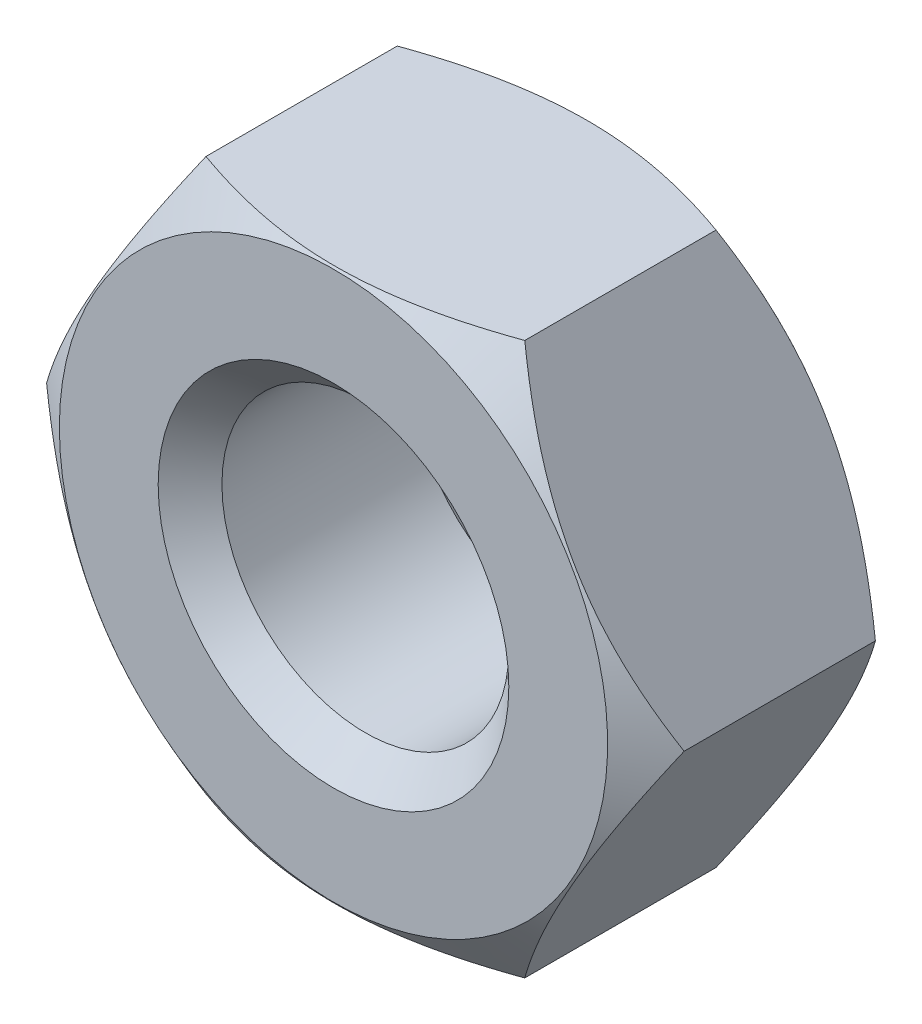
ISO-10303-21;
HEADER;
FILE_DESCRIPTION(('STEP AP214'),'2;1');
FILE_NAME('part.step','',(''),(''),'','','');
FILE_SCHEMA(('AUTOMOTIVE_DESIGN { 1 0 10303 214 1 1 1 1 }'));
ENDSEC;
DATA;
#1=APPLICATION_CONTEXT('core data for automotive mechanical design processes');
#2=APPLICATION_PROTOCOL_DEFINITION('international standard','automotive_design',2000,#1);
#3=PRODUCT_CONTEXT('',#1,'mechanical');
#4=PRODUCT('Part','Part','',(#3));
#5=PRODUCT_RELATED_PRODUCT_CATEGORY('part','',(#4));
#6=PRODUCT_DEFINITION_FORMATION('','',#4);
#7=PRODUCT_DEFINITION_CONTEXT('part definition',#1,'design');
#8=PRODUCT_DEFINITION('design','',#6,#7);
#9=PRODUCT_DEFINITION_SHAPE('','',#8);
#10=(LENGTH_UNIT() NAMED_UNIT(*) SI_UNIT(.MILLI.,.METRE.));
#11=(NAMED_UNIT(*) PLANE_ANGLE_UNIT() SI_UNIT($,.RADIAN.));
#12=(NAMED_UNIT(*) SI_UNIT($,.STERADIAN.) SOLID_ANGLE_UNIT());
#13=UNCERTAINTY_MEASURE_WITH_UNIT(LENGTH_MEASURE(1.E-05),#10,'distance_accuracy_value','');
#14=(GEOMETRIC_REPRESENTATION_CONTEXT(3) GLOBAL_UNCERTAINTY_ASSIGNED_CONTEXT((#13)) GLOBAL_UNIT_ASSIGNED_CONTEXT((#10,
#11,#12)) REPRESENTATION_CONTEXT('',''));
#15=CARTESIAN_POINT('',(0.,0.,0.));
#16=DIRECTION('',(0.,0.,1.));
#17=DIRECTION('',(1.,0.,0.));
#18=AXIS2_PLACEMENT_3D('',#15,#16,#17);
#19=CARTESIAN_POINT('',(-2.5,4.330127018922,4.));
#20=DIRECTION('',(0.,-1.,0.));
#21=DIRECTION('',(0.,0.,-1.));
#22=AXIS2_PLACEMENT_3D('',#19,#20,#21);
#23=PLANE('',#22);
#24=CARTESIAN_POINT('',(2.50000000000005,4.330127018922,0.499999999999857));
#25=CARTESIAN_POINT('',(0.,4.330127018922,-0.392857142857201));
#26=CARTESIAN_POINT('',(-2.50000000000005,4.330127018922,0.499999999999857));
#27=(BOUNDED_CURVE() B_SPLINE_CURVE(2,(#24,#25,#26),.UNSPECIFIED.,.F.,
.F.) B_SPLINE_CURVE_WITH_KNOTS((3,3),(0.744666300403487,1.70909628167328),
.UNSPECIFIED.) CURVE() GEOMETRIC_REPRESENTATION_ITEM() RATIONAL_B_SPLINE_CURVE((1.73418078726004,
2.00245948869616,1.73418078726004)) REPRESENTATION_ITEM(''));
#28=CARTESIAN_POINT('',(2.5,4.330127018922,0.5));
#29=VERTEX_POINT('',#28);
#30=CARTESIAN_POINT('',(-2.5,4.330127018922,0.5));
#31=VERTEX_POINT('',#30);
#32=EDGE_CURVE('E110',#29,#31,#27,.T.);
#33=ORIENTED_EDGE('',*,*,#32,.T.);
#34=DIRECTION('',(0.,0.,-1.));
#35=VECTOR('',#34,1.);
#36=CARTESIAN_POINT('',(-2.5,4.330127018922,3.5));
#37=LINE('',#36,#35);
#38=CARTESIAN_POINT('',(-2.5,4.330127018922,3.5));
#39=VERTEX_POINT('',#38);
#40=EDGE_CURVE('E175',#39,#31,#37,.T.);
#41=ORIENTED_EDGE('',*,*,#40,.F.);
#42=CARTESIAN_POINT('',(2.49999999993008,4.330127018922,3.50000000002513));
#43=CARTESIAN_POINT('',(-2.62403432316205E-11,4.330127018922,4.39285714284783));
#44=CARTESIAN_POINT('',(-2.50000000000005,4.330127018922,3.50000000000014));
#45=(BOUNDED_CURVE() B_SPLINE_CURVE(2,(#42,#43,#44),.UNSPECIFIED.,.F.,
.F.) B_SPLINE_CURVE_WITH_KNOTS((3,3),(-1.61700963427425,-0.690380342458547),
.UNSPECIFIED.) CURVE() GEOMETRIC_REPRESENTATION_ITEM() RATIONAL_B_SPLINE_CURVE((1.6729784116146,
1.93178907257789,1.67297841160832)) REPRESENTATION_ITEM(''));
#46=CARTESIAN_POINT('',(2.5,4.330127018922,3.5));
#47=VERTEX_POINT('',#46);
#48=EDGE_CURVE('E197',#47,#39,#45,.T.);
#49=ORIENTED_EDGE('',*,*,#48,.F.);
#50=DIRECTION('',(0.,0.,-1.));
#51=VECTOR('',#50,1.);
#52=CARTESIAN_POINT('',(2.5,4.330127018922,3.5));
#53=LINE('',#52,#51);
#54=EDGE_CURVE('E11',#47,#29,#53,.T.);
#55=ORIENTED_EDGE('',*,*,#54,.T.);
#56=EDGE_LOOP('',(#33,#41,#49,#55));
#57=FACE_BOUND('',#56,.T.);
#58=ADVANCED_FACE('F17',(#57),#23,.F.);
#59=CARTESIAN_POINT('',(2.5,4.330127018922,4.));
#60=DIRECTION('',(-0.866025403784429,-0.500000000000017,0.));
#61=DIRECTION('',(-0.500000000000017,0.866025403784429,0.));
#62=AXIS2_PLACEMENT_3D('',#59,#60,#61);
#63=PLANE('',#62);
#64=CARTESIAN_POINT('',(5.00000000000001,0.,0.499999999999964));
#65=CARTESIAN_POINT('',(3.74999999999997,2.16506350946104,-0.392857142857063));
#66=CARTESIAN_POINT('',(2.49999999999998,4.33012701892204,0.499999999999854));
#67=(BOUNDED_CURVE() B_SPLINE_CURVE(2,(#64,#65,#66),.UNSPECIFIED.,.F.,
.F.) B_SPLINE_CURVE_WITH_KNOTS((3,3),(0.744666300403462,1.70909628167318),
.UNSPECIFIED.) CURVE() GEOMETRIC_REPRESENTATION_ITEM() RATIONAL_B_SPLINE_CURVE((1.73418078725998,
2.00245948869607,1.73418078726001)) REPRESENTATION_ITEM(''));
#68=CARTESIAN_POINT('',(5.,0.,0.5));
#69=VERTEX_POINT('',#68);
#70=EDGE_CURVE('E162',#69,#29,#67,.T.);
#71=ORIENTED_EDGE('',*,*,#70,.T.);
#72=ORIENTED_EDGE('',*,*,#54,.F.);
#73=CARTESIAN_POINT('',(4.99999999996501,6.05954672002598E-11,3.50000000002503));
#74=CARTESIAN_POINT('',(3.74999999998685,2.16506350948378,4.39285714284769));
#75=CARTESIAN_POINT('',(2.49999999999997,4.33012701892205,3.50000000000014));
#76=(BOUNDED_CURVE() B_SPLINE_CURVE(2,(#73,#74,#75),.UNSPECIFIED.,.F.,
.F.) B_SPLINE_CURVE_WITH_KNOTS((3,3),(-1.61700963427424,-0.690380342458586),
.UNSPECIFIED.) CURVE() GEOMETRIC_REPRESENTATION_ITEM() RATIONAL_B_SPLINE_CURVE((1.67297841161456,
1.93178907257783,1.67297841160831)) REPRESENTATION_ITEM(''));
#77=CARTESIAN_POINT('',(5.,0.,3.5));
#78=VERTEX_POINT('',#77);
#79=EDGE_CURVE('E214',#78,#47,#76,.T.);
#80=ORIENTED_EDGE('',*,*,#79,.F.);
#81=DIRECTION('',(0.,0.,-1.));
#82=VECTOR('',#81,1.);
#83=CARTESIAN_POINT('',(5.,0.,3.5));
#84=LINE('',#83,#82);
#85=EDGE_CURVE('E30',#78,#69,#84,.T.);
#86=ORIENTED_EDGE('',*,*,#85,.T.);
#87=EDGE_LOOP('',(#71,#72,#80,#86));
#88=FACE_BOUND('',#87,.T.);
#89=ADVANCED_FACE('F308',(#88),#63,.F.);
#90=CARTESIAN_POINT('',(5.,0.,4.));
#91=DIRECTION('',(-0.866025403784429,0.500000000000017,0.));
#92=DIRECTION('',(0.,0.,1.));
#93=AXIS2_PLACEMENT_3D('',#90,#91,#92);
#94=PLANE('',#93);
#95=CARTESIAN_POINT('',(2.49999999999998,-4.33012701892204,0.499999999999857));
#96=CARTESIAN_POINT('',(3.74999999999997,-2.16506350946105,-0.392857142857063));
#97=CARTESIAN_POINT('',(5.00000000000001,0.,0.499999999999968));
#98=(BOUNDED_CURVE() B_SPLINE_CURVE(2,(#95,#96,#97),.UNSPECIFIED.,.F.,
.F.) B_SPLINE_CURVE_WITH_KNOTS((3,3),(0.744666300403512,1.70909628167324),
.UNSPECIFIED.) CURVE() GEOMETRIC_REPRESENTATION_ITEM() RATIONAL_B_SPLINE_CURVE((1.73418078726001,
2.00245948869607,1.73418078725999)) REPRESENTATION_ITEM(''));
#99=CARTESIAN_POINT('',(2.5,-4.330127018922,0.5));
#100=VERTEX_POINT('',#99);
#101=EDGE_CURVE('E178',#100,#69,#98,.T.);
#102=ORIENTED_EDGE('',*,*,#101,.T.);
#103=ORIENTED_EDGE('',*,*,#85,.F.);
#104=CARTESIAN_POINT('',(2.50000000003496,-4.33012701886145,3.50000000002513));
#105=CARTESIAN_POINT('',(3.75000000001309,-2.16506350943832,4.39285714284769));
#106=CARTESIAN_POINT('',(5.00000000000001,0.,3.50000000000004));
#107=(BOUNDED_CURVE() B_SPLINE_CURVE(2,(#104,#105,#106),.UNSPECIFIED.,.F.,
.F.) B_SPLINE_CURVE_WITH_KNOTS((3,3),(-1.6170096342742,-0.69038034245854),
.UNSPECIFIED.) CURVE() GEOMETRIC_REPRESENTATION_ITEM() RATIONAL_B_SPLINE_CURVE((1.67297841161459,
1.93178907257783,1.67297841160829)) REPRESENTATION_ITEM(''));
#108=CARTESIAN_POINT('',(2.5,-4.330127018922,3.5));
#109=VERTEX_POINT('',#108);
#110=EDGE_CURVE('E255',#109,#78,#107,.T.);
#111=ORIENTED_EDGE('',*,*,#110,.F.);
#112=DIRECTION('',(0.,0.,-1.));
#113=VECTOR('',#112,1.);
#114=CARTESIAN_POINT('',(2.5,-4.330127018922,3.5));
#115=LINE('',#114,#113);
#116=EDGE_CURVE('E213',#109,#100,#115,.T.);
#117=ORIENTED_EDGE('',*,*,#116,.T.);
#118=EDGE_LOOP('',(#102,#103,#111,#117));
#119=FACE_BOUND('',#118,.T.);
#120=ADVANCED_FACE('F313',(#119),#94,.F.);
#121=CARTESIAN_POINT('',(2.5,-4.330127018922,4.));
#122=DIRECTION('',(0.,1.,0.));
#123=DIRECTION('',(1.,0.,0.));
#124=AXIS2_PLACEMENT_3D('',#121,#122,#123);
#125=PLANE('',#124);
#126=CARTESIAN_POINT('',(-2.50000000000005,-4.330127018922,0.499999999999857));
#127=CARTESIAN_POINT('',(0.,-4.330127018922,-0.392857142857201));
#128=CARTESIAN_POINT('',(2.50000000000005,-4.330127018922,0.499999999999857));
#129=(BOUNDED_CURVE() B_SPLINE_CURVE(2,(#126,#127,#128),.UNSPECIFIED.,.F.,
.F.) B_SPLINE_CURVE_WITH_KNOTS((3,3),(0.744666300403487,1.70909628167328),
.UNSPECIFIED.) CURVE() GEOMETRIC_REPRESENTATION_ITEM() RATIONAL_B_SPLINE_CURVE((1.73418078726004,
2.00245948869616,1.73418078726004)) REPRESENTATION_ITEM(''));
#130=CARTESIAN_POINT('',(-2.5,-4.330127018922,0.5));
#131=VERTEX_POINT('',#130);
#132=EDGE_CURVE('E180',#131,#100,#129,.T.);
#133=ORIENTED_EDGE('',*,*,#132,.T.);
#134=ORIENTED_EDGE('',*,*,#116,.F.);
#135=CARTESIAN_POINT('',(-2.49999999993008,-4.330127018922,3.50000000002513));
#136=CARTESIAN_POINT('',(2.62403432316205E-11,-4.330127018922,4.39285714284783));
#137=CARTESIAN_POINT('',(2.50000000000005,-4.330127018922,3.50000000000014));
#138=(BOUNDED_CURVE() B_SPLINE_CURVE(2,(#135,#136,#137),.UNSPECIFIED.,.F.,
.F.) B_SPLINE_CURVE_WITH_KNOTS((3,3),(-1.61700963427425,-0.690380342458547),
.UNSPECIFIED.) CURVE() GEOMETRIC_REPRESENTATION_ITEM() RATIONAL_B_SPLINE_CURVE((1.6729784116146,
1.93178907257789,1.67297841160832)) REPRESENTATION_ITEM(''));
#139=CARTESIAN_POINT('',(-2.5,-4.330127018922,3.5));
#140=VERTEX_POINT('',#139);
#141=EDGE_CURVE('E247',#140,#109,#138,.T.);
#142=ORIENTED_EDGE('',*,*,#141,.F.);
#143=DIRECTION('',(0.,0.,-1.));
#144=VECTOR('',#143,1.);
#145=CARTESIAN_POINT('',(-2.5,-4.330127018922,3.5));
#146=LINE('',#145,#144);
#147=EDGE_CURVE('E223',#140,#131,#146,.T.);
#148=ORIENTED_EDGE('',*,*,#147,.T.);
#149=EDGE_LOOP('',(#133,#134,#142,#148));
#150=FACE_BOUND('',#149,.T.);
#151=ADVANCED_FACE('F321',(#150),#125,.F.);
#152=CARTESIAN_POINT('',(-2.5,-4.330127018922,4.));
#153=DIRECTION('',(0.866025403784429,0.500000000000017,0.));
#154=DIRECTION('',(0.,0.,-1.));
#155=AXIS2_PLACEMENT_3D('',#152,#153,#154);
#156=PLANE('',#155);
#157=CARTESIAN_POINT('',(-5.00000000000001,0.,0.499999999999964));
#158=CARTESIAN_POINT('',(-3.74999999999997,-2.16506350946104,-0.392857142857063));
#159=CARTESIAN_POINT('',(-2.49999999999998,-4.33012701892204,0.499999999999854));
#160=(BOUNDED_CURVE() B_SPLINE_CURVE(2,(#157,#158,#159),.UNSPECIFIED.,.F.,
.F.) B_SPLINE_CURVE_WITH_KNOTS((3,3),(0.744666300403462,1.70909628167318),
.UNSPECIFIED.) CURVE() GEOMETRIC_REPRESENTATION_ITEM() RATIONAL_B_SPLINE_CURVE((1.73418078725998,
2.00245948869607,1.73418078726001)) REPRESENTATION_ITEM(''));
#161=CARTESIAN_POINT('',(-5.,0.,0.5));
#162=VERTEX_POINT('',#161);
#163=EDGE_CURVE('E120',#162,#131,#160,.T.);
#164=ORIENTED_EDGE('',*,*,#163,.T.);
#165=ORIENTED_EDGE('',*,*,#147,.F.);
#166=CARTESIAN_POINT('',(-4.99999999996501,-6.05954672002598E-11,3.50000000002503));
#167=CARTESIAN_POINT('',(-3.74999999998685,-2.16506350948378,4.39285714284769));
#168=CARTESIAN_POINT('',(-2.49999999999997,-4.33012701892205,3.50000000000014));
#169=(BOUNDED_CURVE() B_SPLINE_CURVE(2,(#166,#167,#168),.UNSPECIFIED.,.F.,
.F.) B_SPLINE_CURVE_WITH_KNOTS((3,3),(-1.61700963427424,-0.690380342458586),
.UNSPECIFIED.) CURVE() GEOMETRIC_REPRESENTATION_ITEM() RATIONAL_B_SPLINE_CURVE((1.67297841161456,
1.93178907257783,1.67297841160831)) REPRESENTATION_ITEM(''));
#170=CARTESIAN_POINT('',(-5.,0.,3.5));
#171=VERTEX_POINT('',#170);
#172=EDGE_CURVE('E159',#171,#140,#169,.T.);
#173=ORIENTED_EDGE('',*,*,#172,.F.);
#174=DIRECTION('',(0.,0.,-1.));
#175=VECTOR('',#174,1.);
#176=CARTESIAN_POINT('',(-5.,0.,3.5));
#177=LINE('',#176,#175);
#178=EDGE_CURVE('E179',#171,#162,#177,.T.);
#179=ORIENTED_EDGE('',*,*,#178,.T.);
#180=EDGE_LOOP('',(#164,#165,#173,#179));
#181=FACE_BOUND('',#180,.T.);
#182=ADVANCED_FACE('F289',(#181),#156,.F.);
#183=CARTESIAN_POINT('',(0.,0.,0.25));
#184=DIRECTION('',(0.,0.,1.));
#185=DIRECTION('',(-1.,0.,0.));
#186=AXIS2_PLACEMENT_3D('',#183,#184,#185);
#187=CONICAL_SURFACE('',#186,4.65,0.950546840812152);
#188=ORIENTED_EDGE('',*,*,#101,.F.);
#189=ORIENTED_EDGE('',*,*,#132,.F.);
#190=ORIENTED_EDGE('',*,*,#163,.F.);
#191=CARTESIAN_POINT('',(-2.49999999999998,4.33012701892204,0.499999999999857));
#192=CARTESIAN_POINT('',(-3.74999999999997,2.16506350946105,-0.392857142857062));
#193=CARTESIAN_POINT('',(-5.00000000000001,0.,0.499999999999964));
#194=(BOUNDED_CURVE() B_SPLINE_CURVE(2,(#191,#192,#193),.UNSPECIFIED.,.F.,
.F.) B_SPLINE_CURVE_WITH_KNOTS((3,3),(-1.70909628167319,-0.744666300403462),
.UNSPECIFIED.) CURVE() GEOMETRIC_REPRESENTATION_ITEM() RATIONAL_B_SPLINE_CURVE((1.73418078726001,
2.00245948869607,1.73418078725999)) REPRESENTATION_ITEM(''));
#195=EDGE_CURVE('E21',#31,#162,#194,.T.);
#196=ORIENTED_EDGE('',*,*,#195,.F.);
#197=ORIENTED_EDGE('',*,*,#32,.F.);
#198=ORIENTED_EDGE('',*,*,#70,.F.);
#199=DIRECTION('',(-0.813733471206779,0.,-0.581238193719034));
#200=VECTOR('',#199,1.);
#201=CARTESIAN_POINT('',(4.65,0.,0.25));
#202=LINE('',#201,#200);
#203=CARTESIAN_POINT('',(4.3,0.,0.));
#204=VERTEX_POINT('',#203);
#205=EDGE_CURVE('E167',#69,#204,#202,.T.);
#206=ORIENTED_EDGE('',*,*,#205,.T.);
#207=CARTESIAN_POINT('',(0.,0.,0.));
#208=DIRECTION('',(0.,0.,1.));
#209=DIRECTION('',(-1.,0.,0.));
#210=AXIS2_PLACEMENT_3D('',#207,#208,#209);
#211=CIRCLE('',#210,4.3);
#212=EDGE_CURVE('E155',#204,#204,#211,.T.);
#213=ORIENTED_EDGE('',*,*,#212,.T.);
#214=ORIENTED_EDGE('',*,*,#205,.F.);
#215=EDGE_LOOP('',(#188,#189,#190,#196,#197,#198,#206,#213,#214));
#216=FACE_BOUND('',#215,.T.);
#217=ADVANCED_FACE('F317',(#216),#187,.T.);
#218=CARTESIAN_POINT('',(-5.,0.,4.));
#219=DIRECTION('',(0.866025403784429,-0.500000000000017,0.));
#220=DIRECTION('',(0.,0.,-1.));
#221=AXIS2_PLACEMENT_3D('',#218,#219,#220);
#222=PLANE('',#221);
#223=ORIENTED_EDGE('',*,*,#195,.T.);
#224=ORIENTED_EDGE('',*,*,#178,.F.);
#225=CARTESIAN_POINT('',(-2.50000000003496,4.33012701886145,3.50000000002513));
#226=CARTESIAN_POINT('',(-3.75000000001309,2.16506350943832,4.39285714284769));
#227=CARTESIAN_POINT('',(-5.00000000000001,0.,3.50000000000004));
#228=(BOUNDED_CURVE() B_SPLINE_CURVE(2,(#225,#226,#227),.UNSPECIFIED.,.F.,
.F.) B_SPLINE_CURVE_WITH_KNOTS((3,3),(-1.6170096342742,-0.69038034245854),
.UNSPECIFIED.) CURVE() GEOMETRIC_REPRESENTATION_ITEM() RATIONAL_B_SPLINE_CURVE((1.67297841161459,
1.93178907257783,1.67297841160829)) REPRESENTATION_ITEM(''));
#229=EDGE_CURVE('E160',#39,#171,#228,.T.);
#230=ORIENTED_EDGE('',*,*,#229,.F.);
#231=ORIENTED_EDGE('',*,*,#40,.T.);
#232=EDGE_LOOP('',(#223,#224,#230,#231));
#233=FACE_BOUND('',#232,.T.);
#234=ADVANCED_FACE('F285',(#233),#222,.F.);
#235=CARTESIAN_POINT('',(0.,0.,3.75));
#236=DIRECTION('',(0.,0.,-1.));
#237=DIRECTION('',(1.,0.,0.));
#238=AXIS2_PLACEMENT_3D('',#235,#236,#237);
#239=CONICAL_SURFACE('',#238,4.65,0.950546840812152);
#240=ORIENTED_EDGE('',*,*,#79,.T.);
#241=ORIENTED_EDGE('',*,*,#48,.T.);
#242=ORIENTED_EDGE('',*,*,#229,.T.);
#243=DIRECTION('',(0.813733471206779,0.,0.581238193719034));
#244=VECTOR('',#243,1.);
#245=CARTESIAN_POINT('',(-4.65,0.,3.75));
#246=LINE('',#245,#244);
#247=CARTESIAN_POINT('',(-4.3,0.,4.));
#248=VERTEX_POINT('',#247);
#249=EDGE_CURVE('E157',#171,#248,#246,.T.);
#250=ORIENTED_EDGE('',*,*,#249,.T.);
#251=CARTESIAN_POINT('',(0.,0.,4.));
#252=DIRECTION('',(0.,0.,1.));
#253=DIRECTION('',(-1.,0.,0.));
#254=AXIS2_PLACEMENT_3D('',#251,#252,#253);
#255=CIRCLE('',#254,4.3);
#256=EDGE_CURVE('E191',#248,#248,#255,.T.);
#257=ORIENTED_EDGE('',*,*,#256,.F.);
#258=ORIENTED_EDGE('',*,*,#249,.F.);
#259=ORIENTED_EDGE('',*,*,#172,.T.);
#260=ORIENTED_EDGE('',*,*,#141,.T.);
#261=ORIENTED_EDGE('',*,*,#110,.T.);
#262=EDGE_LOOP('',(#240,#241,#242,#250,#257,#258,#259,#260,#261));
#263=FACE_BOUND('',#262,.T.);
#264=ADVANCED_FACE('F280',(#263),#239,.T.);
#265=CARTESIAN_POINT('',(0.,0.,4.));
#266=DIRECTION('',(0.,0.,1.));
#267=DIRECTION('',(1.,0.,0.));
#268=AXIS2_PLACEMENT_3D('',#265,#266,#267);
#269=PLANE('',#268);
#270=CARTESIAN_POINT('',(0.,0.,4.));
#271=DIRECTION('',(0.,0.,-1.));
#272=DIRECTION('',(1.,0.,0.));
#273=AXIS2_PLACEMENT_3D('',#270,#271,#272);
#274=CIRCLE('',#273,2.75);
#275=CARTESIAN_POINT('',(-2.75,0.,4.));
#276=VERTEX_POINT('',#275);
#277=EDGE_CURVE('E173',#276,#276,#274,.T.);
#278=ORIENTED_EDGE('',*,*,#277,.T.);
#279=EDGE_LOOP('',(#278));
#280=FACE_BOUND('',#279,.T.);
#281=ORIENTED_EDGE('',*,*,#256,.T.);
#282=EDGE_LOOP('',(#281));
#283=FACE_BOUND('',#282,.T.);
#284=ADVANCED_FACE('F294',(#280,#283),#269,.T.);
#285=CARTESIAN_POINT('',(0.,0.,3.75));
#286=DIRECTION('',(0.,0.,1.));
#287=DIRECTION('',(1.,0.,0.));
#288=AXIS2_PLACEMENT_3D('',#285,#286,#287);
#289=CONICAL_SURFACE('',#288,2.5,0.785398163397448);
#290=CARTESIAN_POINT('',(0.,0.,3.5));
#291=DIRECTION('',(0.,0.,-1.));
#292=DIRECTION('',(-1.,0.,0.));
#293=AXIS2_PLACEMENT_3D('',#290,#291,#292);
#294=CIRCLE('',#293,2.25);
#295=CARTESIAN_POINT('',(-2.25,0.,3.5));
#296=VERTEX_POINT('',#295);
#297=EDGE_CURVE('E174',#296,#296,#294,.T.);
#298=ORIENTED_EDGE('',*,*,#297,.T.);
#299=DIRECTION('',(-0.707106781186548,0.,0.707106781186548));
#300=VECTOR('',#299,1.);
#301=CARTESIAN_POINT('',(-2.5,0.,3.75));
#302=LINE('',#301,#300);
#303=EDGE_CURVE('E66',#296,#276,#302,.T.);
#304=ORIENTED_EDGE('',*,*,#303,.T.);
#305=ORIENTED_EDGE('',*,*,#277,.F.);
#306=ORIENTED_EDGE('',*,*,#303,.F.);
#307=EDGE_LOOP('',(#298,#304,#305,#306));
#308=FACE_BOUND('',#307,.T.);
#309=ADVANCED_FACE('F296',(#308),#289,.F.);
#310=CARTESIAN_POINT('',(0.,0.,0.));
#311=DIRECTION('',(0.,0.,1.));
#312=DIRECTION('',(1.,0.,0.));
#313=AXIS2_PLACEMENT_3D('',#310,#311,#312);
#314=CYLINDRICAL_SURFACE('',#313,2.25);
#315=CARTESIAN_POINT('',(0.,0.,0.5));
#316=DIRECTION('',(0.,0.,-1.));
#317=DIRECTION('',(1.,0.,0.));
#318=AXIS2_PLACEMENT_3D('',#315,#316,#317);
#319=CIRCLE('',#318,2.25);
#320=CARTESIAN_POINT('',(2.25,0.,0.5));
#321=VERTEX_POINT('',#320);
#322=CARTESIAN_POINT('',(-2.25,0.,0.5));
#323=VERTEX_POINT('',#322);
#324=EDGE_CURVE('E142',#321,#323,#319,.T.);
#325=ORIENTED_EDGE('',*,*,#324,.T.);
#326=DIRECTION('',(0.,0.,1.));
#327=VECTOR('',#326,1.);
#328=CARTESIAN_POINT('',(-2.25,0.,0.));
#329=LINE('',#328,#327);
#330=EDGE_CURVE('E82',#323,#296,#329,.T.);
#331=ORIENTED_EDGE('',*,*,#330,.T.);
#332=ORIENTED_EDGE('',*,*,#297,.F.);
#333=ORIENTED_EDGE('',*,*,#330,.F.);
#334=CARTESIAN_POINT('',(0.,0.,0.5));
#335=DIRECTION('',(0.,0.,-1.));
#336=DIRECTION('',(1.,0.,0.));
#337=AXIS2_PLACEMENT_3D('',#334,#335,#336);
#338=CIRCLE('',#337,2.25);
#339=EDGE_CURVE('E144',#323,#321,#338,.T.);
#340=ORIENTED_EDGE('',*,*,#339,.T.);
#341=EDGE_LOOP('',(#325,#331,#332,#333,#340));
#342=FACE_BOUND('',#341,.T.);
#343=ADVANCED_FACE('F19',(#342),#314,.F.);
#344=CARTESIAN_POINT('',(0.,0.,0.25));
#345=DIRECTION('',(0.,0.,-1.));
#346=DIRECTION('',(-1.,0.,0.));
#347=AXIS2_PLACEMENT_3D('',#344,#345,#346);
#348=CONICAL_SURFACE('',#347,2.5,0.785398163397448);
#349=ORIENTED_EDGE('',*,*,#324,.F.);
#350=DIRECTION('',(0.707106781186548,0.,-0.707106781186548));
#351=VECTOR('',#350,1.);
#352=CARTESIAN_POINT('',(2.5,0.,0.25));
#353=LINE('',#352,#351);
#354=CARTESIAN_POINT('',(2.75,0.,0.));
#355=VERTEX_POINT('',#354);
#356=EDGE_CURVE('E137',#321,#355,#353,.T.);
#357=ORIENTED_EDGE('',*,*,#356,.T.);
#358=CARTESIAN_POINT('',(0.,0.,0.));
#359=DIRECTION('',(0.,0.,-1.));
#360=DIRECTION('',(1.,0.,0.));
#361=AXIS2_PLACEMENT_3D('',#358,#359,#360);
#362=CIRCLE('',#361,2.75);
#363=EDGE_CURVE('E140',#355,#355,#362,.T.);
#364=ORIENTED_EDGE('',*,*,#363,.T.);
#365=ORIENTED_EDGE('',*,*,#356,.F.);
#366=ORIENTED_EDGE('',*,*,#339,.F.);
#367=EDGE_LOOP('',(#349,#357,#364,#365,#366));
#368=FACE_BOUND('',#367,.T.);
#369=ADVANCED_FACE('F138',(#368),#348,.F.);
#370=CARTESIAN_POINT('',(0.,0.,0.));
#371=DIRECTION('',(0.,0.,1.));
#372=DIRECTION('',(1.,0.,0.));
#373=AXIS2_PLACEMENT_3D('',#370,#371,#372);
#374=PLANE('',#373);
#375=ORIENTED_EDGE('',*,*,#363,.F.);
#376=EDGE_LOOP('',(#375));
#377=FACE_BOUND('',#376,.T.);
#378=ORIENTED_EDGE('',*,*,#212,.F.);
#379=EDGE_LOOP('',(#378));
#380=FACE_BOUND('',#379,.T.);
#381=ADVANCED_FACE('F369',(#377,#380),#374,.F.);
#382=CLOSED_SHELL('',(#58,#89,#120,#151,#182,#217,#234,#264,#284,#309,#343,#369,#381));
#383=MANIFOLD_SOLID_BREP('B1',#382);
#384=ADVANCED_BREP_SHAPE_REPRESENTATION('',(#18,#383),#14);
#385=SHAPE_DEFINITION_REPRESENTATION(#9,#384);
ENDSEC;
END-ISO-10303-21;
